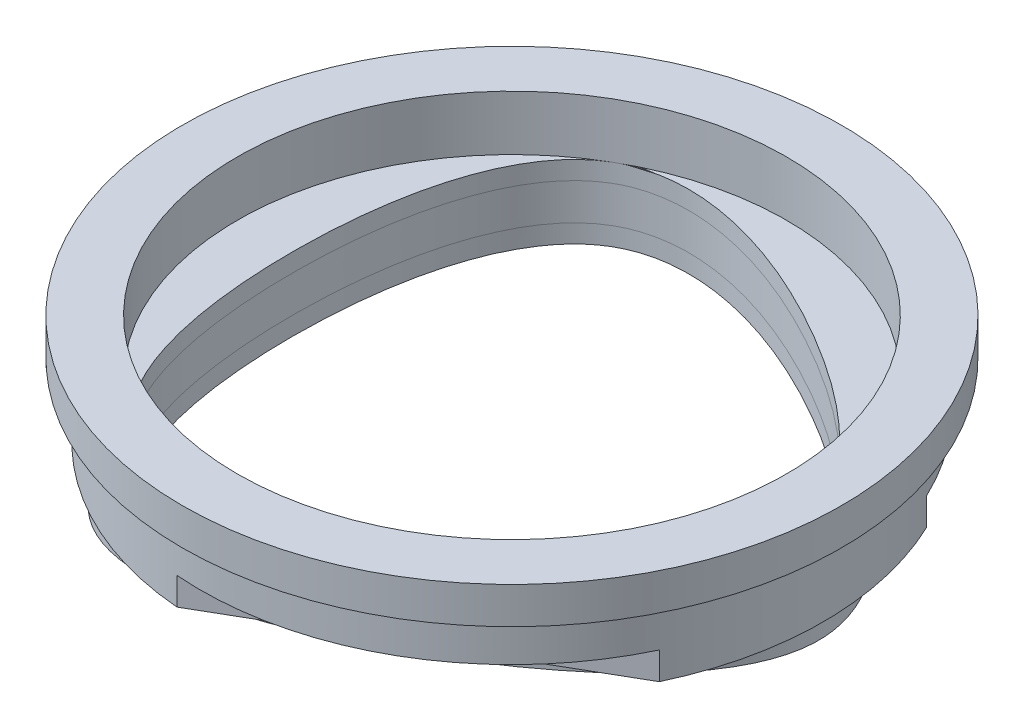
ISO-10303-21;
HEADER;
FILE_DESCRIPTION(('STEP AP214'),'2;1');
FILE_NAME('part.step','',(''),(''),'','','');
FILE_SCHEMA(('AUTOMOTIVE_DESIGN { 1 0 10303 214 1 1 1 1 }'));
ENDSEC;
DATA;
#1=APPLICATION_CONTEXT('core data for automotive mechanical design processes');
#2=APPLICATION_PROTOCOL_DEFINITION('international standard','automotive_design',2000,#1);
#3=PRODUCT_CONTEXT('',#1,'mechanical');
#4=PRODUCT('Part','Part','',(#3));
#5=PRODUCT_RELATED_PRODUCT_CATEGORY('part','',(#4));
#6=PRODUCT_DEFINITION_FORMATION('','',#4);
#7=PRODUCT_DEFINITION_CONTEXT('part definition',#1,'design');
#8=PRODUCT_DEFINITION('design','',#6,#7);
#9=PRODUCT_DEFINITION_SHAPE('','',#8);
#10=(LENGTH_UNIT() NAMED_UNIT(*) SI_UNIT(.MILLI.,.METRE.));
#11=(NAMED_UNIT(*) PLANE_ANGLE_UNIT() SI_UNIT($,.RADIAN.));
#12=(NAMED_UNIT(*) SI_UNIT($,.STERADIAN.) SOLID_ANGLE_UNIT());
#13=UNCERTAINTY_MEASURE_WITH_UNIT(LENGTH_MEASURE(1.E-05),#10,'distance_accuracy_value','');
#14=(GEOMETRIC_REPRESENTATION_CONTEXT(3) GLOBAL_UNCERTAINTY_ASSIGNED_CONTEXT((#13)) GLOBAL_UNIT_ASSIGNED_CONTEXT((#10,
#11,#12)) REPRESENTATION_CONTEXT('',''));
#15=CARTESIAN_POINT('',(0.,0.,0.));
#16=DIRECTION('',(0.,0.,1.));
#17=DIRECTION('',(1.,0.,0.));
#18=AXIS2_PLACEMENT_3D('',#15,#16,#17);
#19=CARTESIAN_POINT('',(-74.9999999999997,40.,129.903810567666));
#20=CARTESIAN_POINT('',(-41.9999999999996,40.,148.956369450924));
#21=CARTESIAN_POINT('',(66.0000000000002,40.,114.315353299546));
#22=CARTESIAN_POINT('',(192.,40.,-1.69876862143176E-13));
#23=CARTESIAN_POINT('',(65.9999999999998,40.,-114.315353299546));
#24=CARTESIAN_POINT('',(-96.0000000000005,40.,-166.276877526612));
#25=CARTESIAN_POINT('',(-132.,40.,3.39301239285928E-13));
#26=CARTESIAN_POINT('',(-108.,40.,110.851251684408));
#27=CARTESIAN_POINT('',(-74.9999999999997,40.,129.903810567666));
#28=B_SPLINE_CURVE_WITH_KNOTS('',3,(#19,#20,#21,#22,#23,#24,#25,#26,#27),.UNSPECIFIED.,.T.,.F.,
(4,1,1,1,1,1,4),(0.,0.166666666666667,0.333333333333333,0.5,0.666666666666667,0.833333333333333,
1.),.UNSPECIFIED.);
#29=DIRECTION('',(0.,-1.,0.));
#30=VECTOR('',#29,1.);
#31=SURFACE_OF_LINEAR_EXTRUSION('',#28,#30);
#32=CARTESIAN_POINT('',(-74.9999999999997,20.,129.903810567666));
#33=CARTESIAN_POINT('',(-41.9999999999996,20.,148.956369450924));
#34=CARTESIAN_POINT('',(66.0000000000002,20.,114.315353299546));
#35=CARTESIAN_POINT('',(192.,20.,-1.69876862143176E-13));
#36=CARTESIAN_POINT('',(65.9999999999998,20.,-114.315353299546));
#37=CARTESIAN_POINT('',(-96.0000000000005,20.,-166.276877526612));
#38=CARTESIAN_POINT('',(-132.,20.,3.39301239285928E-13));
#39=CARTESIAN_POINT('',(-108.,20.,110.851251684408));
#40=CARTESIAN_POINT('',(-74.9999999999997,20.,129.903810567666));
#41=B_SPLINE_CURVE_WITH_KNOTS('',3,(#32,#33,#34,#35,#36,#37,#38,#39,#40),.UNSPECIFIED.,.T.,.F.,
(4,1,1,1,1,1,4),(0.,0.166666666666667,0.333333333333333,0.5,0.666666666666667,0.833333333333333,
1.),.UNSPECIFIED.);
#42=CARTESIAN_POINT('',(-74.9999999999997,20.,129.903810567666));
#43=VERTEX_POINT('',#42);
#44=EDGE_CURVE('E195',#43,#43,#41,.T.);
#45=ORIENTED_EDGE('',*,*,#44,.F.);
#46=EDGE_LOOP('',(#45));
#47=FACE_BOUND('',#46,.T.);
#48=CARTESIAN_POINT('',(-74.9999999999997,30.,129.903810567666));
#49=CARTESIAN_POINT('',(-41.9999999999996,30.,148.956369450924));
#50=CARTESIAN_POINT('',(66.0000000000002,30.,114.315353299546));
#51=CARTESIAN_POINT('',(192.,30.,-1.69876862143176E-13));
#52=CARTESIAN_POINT('',(65.9999999999998,30.,-114.315353299546));
#53=CARTESIAN_POINT('',(-96.0000000000005,30.,-166.276877526612));
#54=CARTESIAN_POINT('',(-132.,30.,3.39301239285928E-13));
#55=CARTESIAN_POINT('',(-108.,30.,110.851251684408));
#56=CARTESIAN_POINT('',(-74.9999999999997,30.,129.903810567666));
#57=B_SPLINE_CURVE_WITH_KNOTS('',3,(#48,#49,#50,#51,#52,#53,#54,#55,#56),.UNSPECIFIED.,.T.,.F.,
(4,1,1,1,1,1,4),(0.,0.166666666666667,0.333333333333333,0.5,0.666666666666667,0.833333333333333,
1.),.UNSPECIFIED.);
#58=CARTESIAN_POINT('',(-75.0000000000005,30.,-129.903810567666));
#59=VERTEX_POINT('',#58);
#60=CARTESIAN_POINT('',(-74.9999999999997,30.,129.903810567666));
#61=VERTEX_POINT('',#60);
#62=EDGE_CURVE('E44',#59,#61,#57,.T.);
#63=ORIENTED_EDGE('',*,*,#62,.T.);
#64=CARTESIAN_POINT('',(150.,30.,-1.28280281941189E-13));
#65=VERTEX_POINT('',#64);
#66=EDGE_CURVE('E11',#61,#65,#57,.T.);
#67=ORIENTED_EDGE('',*,*,#66,.T.);
#68=EDGE_CURVE('E52',#65,#59,#57,.T.);
#69=ORIENTED_EDGE('',*,*,#68,.T.);
#70=EDGE_LOOP('',(#63,#67,#69));
#71=FACE_BOUND('',#70,.T.);
#72=ADVANCED_FACE('F39',(#47,#71),#31,.T.);
#73=CARTESIAN_POINT('',(66.2499999999992,-10.,-114.748366001438));
#74=CARTESIAN_POINT('',(12.499999999999,-10.,-145.78094297038));
#75=CARTESIAN_POINT('',(-107.500000000001,-10.,-186.195461813654));
#76=CARTESIAN_POINT('',(-145.,-10.,4.46881482195118E-13));
#77=CARTESIAN_POINT('',(-107.5,-10.,186.195461813655));
#78=CARTESIAN_POINT('',(72.5000000000002,-10.,125.573683548743));
#79=CARTESIAN_POINT('',(215.,-10.,-4.2890687836575E-13));
#80=CARTESIAN_POINT('',(119.999999999999,-10.,-83.7157890324953));
#81=CARTESIAN_POINT('',(66.2499999999992,-10.,-114.748366001438));
#82=B_SPLINE_CURVE_WITH_KNOTS('',3,(#73,#74,#75,#76,#77,#78,#79,#80,#81),.UNSPECIFIED.,.T.,.F.,
(4,1,1,1,1,1,4),(0.,0.166666666666667,0.333333333333333,0.5,0.666666666666667,0.833333333333333,
1.),.UNSPECIFIED.);
#83=DIRECTION('',(0.,1.,0.));
#84=VECTOR('',#83,1.);
#85=SURFACE_OF_LINEAR_EXTRUSION('',#82,#84);
#86=CARTESIAN_POINT('',(66.2499999999992,-10.,-114.748366001438));
#87=VERTEX_POINT('',#86);
#88=EDGE_CURVE('E127',#87,#87,#82,.T.);
#89=ORIENTED_EDGE('',*,*,#88,.T.);
#90=EDGE_LOOP('',(#89));
#91=FACE_BOUND('',#90,.T.);
#92=CARTESIAN_POINT('',(66.2499999999992,0.,-114.748366001438));
#93=CARTESIAN_POINT('',(12.499999999999,0.,-145.78094297038));
#94=CARTESIAN_POINT('',(-107.500000000001,0.,-186.195461813654));
#95=CARTESIAN_POINT('',(-145.,0.,4.46881482195118E-13));
#96=CARTESIAN_POINT('',(-107.5,0.,186.195461813655));
#97=CARTESIAN_POINT('',(72.5000000000002,0.,125.573683548743));
#98=CARTESIAN_POINT('',(215.,0.,-4.2890687836575E-13));
#99=CARTESIAN_POINT('',(119.999999999999,0.,-83.7157890324953));
#100=CARTESIAN_POINT('',(66.2499999999992,0.,-114.748366001438));
#101=B_SPLINE_CURVE_WITH_KNOTS('',3,(#92,#93,#94,#95,#96,#97,#98,#99,#100),.UNSPECIFIED.,.T.,
.F.,(4,1,1,1,1,1,4),(0.,0.166666666666667,0.333333333333333,0.5,0.666666666666667,
0.833333333333333,1.),.UNSPECIFIED.);
#102=CARTESIAN_POINT('',(66.2499999999992,0.,-114.748366001438));
#103=VERTEX_POINT('',#102);
#104=EDGE_CURVE('E130',#103,#103,#101,.T.);
#105=ORIENTED_EDGE('',*,*,#104,.F.);
#106=EDGE_LOOP('',(#105));
#107=FACE_BOUND('',#106,.T.);
#108=ADVANCED_FACE('F41',(#91,#107),#85,.T.);
#109=CARTESIAN_POINT('',(-83.7499999999996,-10.,145.059255133894));
#110=DIRECTION('',(0.,1.,0.));
#111=DIRECTION('',(0.,0.,1.));
#112=AXIS2_PLACEMENT_3D('',#109,#110,#111);
#113=PLANE('',#112);
#114=CARTESIAN_POINT('',(60.,-10.,-103.923048454133));
#115=CARTESIAN_POINT('',(11.9999999999998,-10.,-131.635861375235));
#116=CARTESIAN_POINT('',(-96.0000000000005,-10.,-166.276877526612));
#117=CARTESIAN_POINT('',(-132.,-10.,3.65362127849554E-13));
#118=CARTESIAN_POINT('',(-95.9999999999997,-10.,166.276877526613));
#119=CARTESIAN_POINT('',(66.0000000000002,-10.,114.315353299546));
#120=CARTESIAN_POINT('',(192.,-10.,0.));
#121=CARTESIAN_POINT('',(108.,-10.,-76.2102355330306));
#122=CARTESIAN_POINT('',(60.,-10.,-103.923048454133));
#123=B_SPLINE_CURVE_WITH_KNOTS('',3,(#114,#115,#116,#117,#118,#119,#120,#121,#122),
.UNSPECIFIED.,.T.,.F.,(4,1,1,1,1,1,4),(0.,0.166666666666667,0.333333333333333,0.5,
0.666666666666667,0.833333333333333,1.),.UNSPECIFIED.);
#124=CARTESIAN_POINT('',(60.,-10.,-103.923048454133));
#125=VERTEX_POINT('',#124);
#126=EDGE_CURVE('E135',#125,#125,#123,.T.);
#127=ORIENTED_EDGE('',*,*,#126,.T.);
#128=EDGE_LOOP('',(#127));
#129=FACE_BOUND('',#128,.T.);
#130=ORIENTED_EDGE('',*,*,#88,.F.);
#131=EDGE_LOOP('',(#130));
#132=FACE_BOUND('',#131,.T.);
#133=ADVANCED_FACE('F164',(#129,#132),#113,.F.);
#134=DIRECTION('',(0.,1.,0.));
#135=VECTOR('',#134,1.);
#136=SURFACE_OF_LINEAR_EXTRUSION('',#123,#135);
#137=ORIENTED_EDGE('',*,*,#126,.F.);
#138=EDGE_LOOP('',(#137));
#139=FACE_BOUND('',#138,.T.);
#140=CARTESIAN_POINT('',(-75.0000000000007,0.,-129.903810567665));
#141=CARTESIAN_POINT('',(-108.,0.,-110.851251684408));
#142=CARTESIAN_POINT('',(-132.,0.,2.13082205778997E-13));
#143=CARTESIAN_POINT('',(-95.9999999999997,0.,166.276877526613));
#144=CARTESIAN_POINT('',(66.0000000000002,0.,114.315353299546));
#145=CARTESIAN_POINT('',(192.,0.,-1.16534567007794E-13));
#146=CARTESIAN_POINT('',(65.9999999999999,0.,-114.315353299546));
#147=CARTESIAN_POINT('',(-42.0000000000006,0.,-148.956369450923));
#148=CARTESIAN_POINT('',(-75.0000000000007,0.,-129.903810567665));
#149=B_SPLINE_CURVE_WITH_KNOTS('',3,(#140,#141,#142,#143,#144,#145,#146,#147,#148),
.UNSPECIFIED.,.T.,.F.,(4,1,1,1,1,1,4),(0.,0.166666666666666,0.333333333333333,0.5,
0.666666666666666,0.833333333333333,1.),.UNSPECIFIED.);
#150=CARTESIAN_POINT('',(-75.0000000000007,0.,-129.903810567665));
#151=VERTEX_POINT('',#150);
#152=EDGE_CURVE('E211',#151,#151,#149,.T.);
#153=ORIENTED_EDGE('',*,*,#152,.T.);
#154=EDGE_LOOP('',(#153));
#155=FACE_BOUND('',#154,.T.);
#156=ADVANCED_FACE('F160',(#139,#155),#136,.F.);
#157=CARTESIAN_POINT('',(0.,0.,0.));
#158=DIRECTION('',(0.,1.,0.));
#159=DIRECTION('',(0.,0.,1.));
#160=AXIS2_PLACEMENT_3D('',#157,#158,#159);
#161=PLANE('',#160);
#162=CARTESIAN_POINT('',(0.,0.,0.));
#163=DIRECTION('',(0.,1.,0.));
#164=DIRECTION('',(0.,0.,1.));
#165=AXIS2_PLACEMENT_3D('',#162,#163,#164);
#166=CIRCLE('',#165,170.);
#167=CARTESIAN_POINT('',(-13.5164654424508,0.,-169.461810334786));
#168=VERTEX_POINT('',#167);
#169=CARTESIAN_POINT('',(-140.,0.,-96.4365076099295));
#170=VERTEX_POINT('',#169);
#171=EDGE_CURVE('E224',#168,#170,#166,.T.);
#172=ORIENTED_EDGE('',*,*,#171,.F.);
#173=DIRECTION('',(-0.86602540378444,0.,-0.499999999999998));
#174=VECTOR('',#173,1.);
#175=CARTESIAN_POINT('',(-13.5164654424508,0.,-169.461810334786));
#176=LINE('',#175,#174);
#177=CARTESIAN_POINT('',(153.51646544245,0.,-73.0253027248571));
#178=VERTEX_POINT('',#177);
#179=EDGE_CURVE('E246',#178,#168,#176,.T.);
#180=ORIENTED_EDGE('',*,*,#179,.F.);
#181=CARTESIAN_POINT('',(0.,0.,0.));
#182=DIRECTION('',(0.,1.,0.));
#183=DIRECTION('',(0.,0.,1.));
#184=AXIS2_PLACEMENT_3D('',#181,#182,#183);
#185=CIRCLE('',#184,170.);
#186=CARTESIAN_POINT('',(153.51646544245,0.,73.0253027248566));
#187=VERTEX_POINT('',#186);
#188=EDGE_CURVE('E242',#187,#178,#185,.T.);
#189=ORIENTED_EDGE('',*,*,#188,.F.);
#190=DIRECTION('',(0.866025403784438,0.,-0.5));
#191=VECTOR('',#190,1.);
#192=CARTESIAN_POINT('',(153.51646544245,0.,73.0253027248566));
#193=LINE('',#192,#191);
#194=CARTESIAN_POINT('',(-13.5164654424503,0.,169.461810334786));
#195=VERTEX_POINT('',#194);
#196=EDGE_CURVE('E238',#195,#187,#193,.T.);
#197=ORIENTED_EDGE('',*,*,#196,.F.);
#198=CARTESIAN_POINT('',(0.,0.,0.));
#199=DIRECTION('',(0.,1.,0.));
#200=DIRECTION('',(0.,0.,1.));
#201=AXIS2_PLACEMENT_3D('',#198,#199,#200);
#202=CIRCLE('',#201,170.);
#203=CARTESIAN_POINT('',(-140.,0.,96.4365076099295));
#204=VERTEX_POINT('',#203);
#205=EDGE_CURVE('E234',#204,#195,#202,.T.);
#206=ORIENTED_EDGE('',*,*,#205,.F.);
#207=DIRECTION('',(0.,0.,1.));
#208=VECTOR('',#207,1.);
#209=CARTESIAN_POINT('',(-140.,0.,96.4365076099296));
#210=LINE('',#209,#208);
#211=EDGE_CURVE('E230',#170,#204,#210,.T.);
#212=ORIENTED_EDGE('',*,*,#211,.F.);
#213=EDGE_LOOP('',(#172,#180,#189,#197,#206,#212));
#214=FACE_BOUND('',#213,.T.);
#215=ORIENTED_EDGE('',*,*,#104,.T.);
#216=EDGE_LOOP('',(#215));
#217=FACE_BOUND('',#216,.T.);
#218=ADVANCED_FACE('F163',(#214,#217),#161,.F.);
#219=CARTESIAN_POINT('',(0.,20.,0.));
#220=DIRECTION('',(0.,-1.,0.));
#221=DIRECTION('',(0.,0.,-1.));
#222=AXIS2_PLACEMENT_3D('',#219,#220,#221);
#223=CYLINDRICAL_SURFACE('',#222,170.);
#224=DIRECTION('',(0.,-1.,0.));
#225=VECTOR('',#224,1.);
#226=CARTESIAN_POINT('',(153.51646544245,20.,-73.0253027248571));
#227=LINE('',#226,#225);
#228=CARTESIAN_POINT('',(153.51646544245,15.,-73.0253027248571));
#229=VERTEX_POINT('',#228);
#230=EDGE_CURVE('E251',#229,#178,#227,.T.);
#231=ORIENTED_EDGE('',*,*,#230,.F.);
#232=CARTESIAN_POINT('',(0.,15.,0.));
#233=DIRECTION('',(0.,-1.,0.));
#234=DIRECTION('',(0.,0.,-1.));
#235=AXIS2_PLACEMENT_3D('',#232,#233,#234);
#236=CIRCLE('',#235,170.);
#237=CARTESIAN_POINT('',(-13.5164654424508,15.,-169.461810334786));
#238=VERTEX_POINT('',#237);
#239=EDGE_CURVE('E125',#238,#229,#236,.T.);
#240=ORIENTED_EDGE('',*,*,#239,.F.);
#241=DIRECTION('',(0.,-1.,0.));
#242=VECTOR('',#241,1.);
#243=CARTESIAN_POINT('',(-13.5164654424508,20.,-169.461810334786));
#244=LINE('',#243,#242);
#245=EDGE_CURVE('E66',#238,#168,#244,.T.);
#246=ORIENTED_EDGE('',*,*,#245,.T.);
#247=ORIENTED_EDGE('',*,*,#171,.T.);
#248=DIRECTION('',(0.,-1.,0.));
#249=VECTOR('',#248,1.);
#250=CARTESIAN_POINT('',(-140.,20.,-96.4365076099295));
#251=LINE('',#250,#249);
#252=CARTESIAN_POINT('',(-140.,15.,-96.4365076099295));
#253=VERTEX_POINT('',#252);
#254=EDGE_CURVE('E154',#253,#170,#251,.T.);
#255=ORIENTED_EDGE('',*,*,#254,.F.);
#256=CARTESIAN_POINT('',(0.,15.,0.));
#257=DIRECTION('',(0.,-1.,0.));
#258=DIRECTION('',(0.,0.,-1.));
#259=AXIS2_PLACEMENT_3D('',#256,#257,#258);
#260=CIRCLE('',#259,170.);
#261=CARTESIAN_POINT('',(-140.,15.,96.4365076099295));
#262=VERTEX_POINT('',#261);
#263=EDGE_CURVE('E448',#262,#253,#260,.T.);
#264=ORIENTED_EDGE('',*,*,#263,.F.);
#265=DIRECTION('',(0.,-1.,0.));
#266=VECTOR('',#265,1.);
#267=CARTESIAN_POINT('',(-140.,20.,96.4365076099295));
#268=LINE('',#267,#266);
#269=EDGE_CURVE('E259',#262,#204,#268,.T.);
#270=ORIENTED_EDGE('',*,*,#269,.T.);
#271=ORIENTED_EDGE('',*,*,#205,.T.);
#272=DIRECTION('',(0.,-1.,0.));
#273=VECTOR('',#272,1.);
#274=CARTESIAN_POINT('',(-13.5164654424503,20.,169.461810334786));
#275=LINE('',#274,#273);
#276=CARTESIAN_POINT('',(-13.5164654424503,15.,169.461810334786));
#277=VERTEX_POINT('',#276);
#278=EDGE_CURVE('E257',#277,#195,#275,.T.);
#279=ORIENTED_EDGE('',*,*,#278,.F.);
#280=CARTESIAN_POINT('',(0.,15.,0.));
#281=DIRECTION('',(0.,-1.,0.));
#282=DIRECTION('',(0.,0.,-1.));
#283=AXIS2_PLACEMENT_3D('',#280,#281,#282);
#284=CIRCLE('',#283,170.);
#285=CARTESIAN_POINT('',(153.51646544245,15.,73.0253027248566));
#286=VERTEX_POINT('',#285);
#287=EDGE_CURVE('E441',#286,#277,#284,.T.);
#288=ORIENTED_EDGE('',*,*,#287,.F.);
#289=DIRECTION('',(0.,-1.,0.));
#290=VECTOR('',#289,1.);
#291=CARTESIAN_POINT('',(153.51646544245,20.,73.0253027248566));
#292=LINE('',#291,#290);
#293=EDGE_CURVE('E254',#286,#187,#292,.T.);
#294=ORIENTED_EDGE('',*,*,#293,.T.);
#295=ORIENTED_EDGE('',*,*,#188,.T.);
#296=EDGE_LOOP('',(#231,#240,#246,#247,#255,#264,#270,#271,#279,#288,#294,#295));
#297=FACE_BOUND('',#296,.T.);
#298=CARTESIAN_POINT('',(5.33338368758333E-13,40.,-3.17794666316295E-13));
#299=DIRECTION('',(0.,1.,0.));
#300=DIRECTION('',(0.,0.,1.));
#301=AXIS2_PLACEMENT_3D('',#298,#299,#300);
#302=CIRCLE('',#301,170.);
#303=CARTESIAN_POINT('',(5.33338368758333E-13,40.,170.));
#304=VERTEX_POINT('',#303);
#305=EDGE_CURVE('E204',#304,#304,#302,.T.);
#306=ORIENTED_EDGE('',*,*,#305,.F.);
#307=EDGE_LOOP('',(#306));
#308=FACE_BOUND('',#307,.T.);
#309=ADVANCED_FACE('F166',(#297,#308),#223,.T.);
#310=CARTESIAN_POINT('',(-140.,20.,96.4365076099296));
#311=DIRECTION('',(1.,0.,0.));
#312=DIRECTION('',(0.,0.,-1.));
#313=AXIS2_PLACEMENT_3D('',#310,#311,#312);
#314=PLANE('',#313);
#315=ORIENTED_EDGE('',*,*,#269,.F.);
#316=DIRECTION('',(0.,0.,1.));
#317=VECTOR('',#316,1.);
#318=CARTESIAN_POINT('',(-140.,15.,96.4365076099295));
#319=LINE('',#318,#317);
#320=EDGE_CURVE('E270',#253,#262,#319,.T.);
#321=ORIENTED_EDGE('',*,*,#320,.F.);
#322=ORIENTED_EDGE('',*,*,#254,.T.);
#323=ORIENTED_EDGE('',*,*,#211,.T.);
#324=EDGE_LOOP('',(#315,#321,#322,#323));
#325=FACE_BOUND('',#324,.T.);
#326=ADVANCED_FACE('F268',(#325),#314,.F.);
#327=CARTESIAN_POINT('',(153.51646544245,20.,73.0253027248566));
#328=DIRECTION('',(-0.5,0.,-0.866025403784438));
#329=DIRECTION('',(-0.866025403784439,0.,0.5));
#330=AXIS2_PLACEMENT_3D('',#327,#328,#329);
#331=PLANE('',#330);
#332=ORIENTED_EDGE('',*,*,#293,.F.);
#333=DIRECTION('',(0.866025403784438,0.,-0.5));
#334=VECTOR('',#333,1.);
#335=CARTESIAN_POINT('',(-13.5164654424503,15.,169.461810334786));
#336=LINE('',#335,#334);
#337=EDGE_CURVE('E437',#277,#286,#336,.T.);
#338=ORIENTED_EDGE('',*,*,#337,.F.);
#339=ORIENTED_EDGE('',*,*,#278,.T.);
#340=ORIENTED_EDGE('',*,*,#196,.T.);
#341=EDGE_LOOP('',(#332,#338,#339,#340));
#342=FACE_BOUND('',#341,.T.);
#343=ADVANCED_FACE('F381',(#342),#331,.F.);
#344=CARTESIAN_POINT('',(-13.5164654424508,20.,-169.461810334786));
#345=DIRECTION('',(-0.499999999999998,0.,0.86602540378444));
#346=DIRECTION('',(0.86602540378444,0.,0.499999999999998));
#347=AXIS2_PLACEMENT_3D('',#344,#345,#346);
#348=PLANE('',#347);
#349=ORIENTED_EDGE('',*,*,#245,.F.);
#350=DIRECTION('',(-0.86602540378444,0.,-0.499999999999998));
#351=VECTOR('',#350,1.);
#352=CARTESIAN_POINT('',(-13.5164654424508,15.,-169.461810334786));
#353=LINE('',#352,#351);
#354=EDGE_CURVE('E451',#229,#238,#353,.T.);
#355=ORIENTED_EDGE('',*,*,#354,.F.);
#356=ORIENTED_EDGE('',*,*,#230,.T.);
#357=ORIENTED_EDGE('',*,*,#179,.T.);
#358=EDGE_LOOP('',(#349,#355,#356,#357));
#359=FACE_BOUND('',#358,.T.);
#360=ADVANCED_FACE('F291',(#359),#348,.F.);
#361=CARTESIAN_POINT('',(-75.0000000000007,20.,-129.903810567665));
#362=CARTESIAN_POINT('',(-108.,20.,-110.851251684408));
#363=CARTESIAN_POINT('',(-132.,20.,2.13082205778997E-13));
#364=CARTESIAN_POINT('',(-95.9999999999997,20.,166.276877526613));
#365=CARTESIAN_POINT('',(66.0000000000002,20.,114.315353299546));
#366=CARTESIAN_POINT('',(192.,20.,-1.16534567007794E-13));
#367=CARTESIAN_POINT('',(65.9999999999999,20.,-114.315353299546));
#368=CARTESIAN_POINT('',(-42.0000000000006,20.,-148.956369450923));
#369=CARTESIAN_POINT('',(-75.0000000000007,20.,-129.903810567665));
#370=B_SPLINE_CURVE_WITH_KNOTS('',3,(#361,#362,#363,#364,#365,#366,#367,#368,#369),
.UNSPECIFIED.,.T.,.F.,(4,1,1,1,1,1,4),(0.,0.166666666666666,0.333333333333333,0.5,
0.666666666666666,0.833333333333333,1.),.UNSPECIFIED.);
#371=DIRECTION('',(0.,-1.,0.));
#372=VECTOR('',#371,1.);
#373=SURFACE_OF_LINEAR_EXTRUSION('',#370,#372);
#374=ORIENTED_EDGE('',*,*,#44,.T.);
#375=EDGE_LOOP('',(#374));
#376=FACE_BOUND('',#375,.T.);
#377=ORIENTED_EDGE('',*,*,#152,.F.);
#378=EDGE_LOOP('',(#377));
#379=FACE_BOUND('',#378,.T.);
#380=ADVANCED_FACE('F185',(#376,#379),#373,.T.);
#381=CARTESIAN_POINT('',(0.,40.,0.));
#382=DIRECTION('',(0.,1.,0.));
#383=DIRECTION('',(0.,0.,1.));
#384=AXIS2_PLACEMENT_3D('',#381,#382,#383);
#385=PLANE('',#384);
#386=CARTESIAN_POINT('',(0.,40.,0.));
#387=DIRECTION('',(0.,1.,0.));
#388=DIRECTION('',(0.,0.,1.));
#389=AXIS2_PLACEMENT_3D('',#386,#387,#388);
#390=CIRCLE('',#389,180.);
#391=CARTESIAN_POINT('',(0.,40.,180.));
#392=VERTEX_POINT('',#391);
#393=EDGE_CURVE('E193',#392,#392,#390,.T.);
#394=ORIENTED_EDGE('',*,*,#393,.F.);
#395=EDGE_LOOP('',(#394));
#396=FACE_BOUND('',#395,.T.);
#397=ORIENTED_EDGE('',*,*,#305,.T.);
#398=EDGE_LOOP('',(#397));
#399=FACE_BOUND('',#398,.T.);
#400=ADVANCED_FACE('F281',(#396,#399),#385,.F.);
#401=CARTESIAN_POINT('',(0.,60.,0.));
#402=DIRECTION('',(0.,1.,0.));
#403=DIRECTION('',(0.,0.,1.));
#404=AXIS2_PLACEMENT_3D('',#401,#402,#403);
#405=PLANE('',#404);
#406=CARTESIAN_POINT('',(0.,60.,0.));
#407=DIRECTION('',(0.,1.,0.));
#408=DIRECTION('',(0.,0.,1.));
#409=AXIS2_PLACEMENT_3D('',#406,#407,#408);
#410=CIRCLE('',#409,180.);
#411=CARTESIAN_POINT('',(0.,60.,180.));
#412=VERTEX_POINT('',#411);
#413=EDGE_CURVE('E205',#412,#412,#410,.T.);
#414=ORIENTED_EDGE('',*,*,#413,.T.);
#415=EDGE_LOOP('',(#414));
#416=FACE_BOUND('',#415,.T.);
#417=CARTESIAN_POINT('',(0.,60.,0.));
#418=DIRECTION('',(0.,1.,0.));
#419=DIRECTION('',(0.,0.,1.));
#420=AXIS2_PLACEMENT_3D('',#417,#418,#419);
#421=CIRCLE('',#420,150.);
#422=CARTESIAN_POINT('',(0.,60.,150.));
#423=VERTEX_POINT('',#422);
#424=EDGE_CURVE('E433',#423,#423,#421,.T.);
#425=ORIENTED_EDGE('',*,*,#424,.F.);
#426=EDGE_LOOP('',(#425));
#427=FACE_BOUND('',#426,.T.);
#428=ADVANCED_FACE('F283',(#416,#427),#405,.T.);
#429=CARTESIAN_POINT('',(0.,60.,0.));
#430=DIRECTION('',(0.,-1.,0.));
#431=DIRECTION('',(0.,0.,-1.));
#432=AXIS2_PLACEMENT_3D('',#429,#430,#431);
#433=CYLINDRICAL_SURFACE('',#432,180.);
#434=ORIENTED_EDGE('',*,*,#413,.F.);
#435=EDGE_LOOP('',(#434));
#436=FACE_BOUND('',#435,.T.);
#437=ORIENTED_EDGE('',*,*,#393,.T.);
#438=EDGE_LOOP('',(#437));
#439=FACE_BOUND('',#438,.T.);
#440=ADVANCED_FACE('F183',(#436,#439),#433,.T.);
#441=CARTESIAN_POINT('',(0.,60.,0.));
#442=DIRECTION('',(0.,-1.,0.));
#443=DIRECTION('',(0.,0.,-1.));
#444=AXIS2_PLACEMENT_3D('',#441,#442,#443);
#445=CYLINDRICAL_SURFACE('',#444,150.);
#446=CARTESIAN_POINT('',(0.,30.,0.));
#447=DIRECTION('',(0.,1.,0.));
#448=DIRECTION('',(0.,0.,1.));
#449=AXIS2_PLACEMENT_3D('',#446,#447,#448);
#450=CIRCLE('',#449,150.);
#451=EDGE_CURVE('E111',#65,#59,#450,.T.);
#452=ORIENTED_EDGE('',*,*,#451,.F.);
#453=EDGE_CURVE('E117',#61,#65,#450,.T.);
#454=ORIENTED_EDGE('',*,*,#453,.F.);
#455=EDGE_CURVE('E58',#59,#61,#450,.T.);
#456=ORIENTED_EDGE('',*,*,#455,.F.);
#457=EDGE_LOOP('',(#452,#454,#456));
#458=FACE_BOUND('',#457,.T.);
#459=ORIENTED_EDGE('',*,*,#424,.T.);
#460=EDGE_LOOP('',(#459));
#461=FACE_BOUND('',#460,.T.);
#462=ADVANCED_FACE('F122',(#458,#461),#445,.F.);
#463=CARTESIAN_POINT('',(0.,15.,0.));
#464=DIRECTION('',(0.,-1.,0.));
#465=DIRECTION('',(0.,0.,-1.));
#466=AXIS2_PLACEMENT_3D('',#463,#464,#465);
#467=PLANE('',#466);
#468=ORIENTED_EDGE('',*,*,#287,.T.);
#469=ORIENTED_EDGE('',*,*,#337,.T.);
#470=EDGE_LOOP('',(#468,#469));
#471=FACE_BOUND('',#470,.T.);
#472=ADVANCED_FACE('F297',(#471),#467,.T.);
#473=CARTESIAN_POINT('',(0.,15.,0.));
#474=DIRECTION('',(0.,-1.,0.));
#475=DIRECTION('',(0.,0.,-1.));
#476=AXIS2_PLACEMENT_3D('',#473,#474,#475);
#477=PLANE('',#476);
#478=ORIENTED_EDGE('',*,*,#263,.T.);
#479=ORIENTED_EDGE('',*,*,#320,.T.);
#480=EDGE_LOOP('',(#478,#479));
#481=FACE_BOUND('',#480,.T.);
#482=ADVANCED_FACE('F300',(#481),#477,.T.);
#483=CARTESIAN_POINT('',(0.,15.,0.));
#484=DIRECTION('',(0.,-1.,0.));
#485=DIRECTION('',(0.,0.,-1.));
#486=AXIS2_PLACEMENT_3D('',#483,#484,#485);
#487=PLANE('',#486);
#488=ORIENTED_EDGE('',*,*,#239,.T.);
#489=ORIENTED_EDGE('',*,*,#354,.T.);
#490=EDGE_LOOP('',(#488,#489));
#491=FACE_BOUND('',#490,.T.);
#492=ADVANCED_FACE('F304',(#491),#487,.T.);
#493=CARTESIAN_POINT('',(0.,30.,0.));
#494=DIRECTION('',(0.,1.,0.));
#495=DIRECTION('',(0.,0.,1.));
#496=AXIS2_PLACEMENT_3D('',#493,#494,#495);
#497=PLANE('',#496);
#498=ORIENTED_EDGE('',*,*,#453,.T.);
#499=ORIENTED_EDGE('',*,*,#66,.F.);
#500=EDGE_LOOP('',(#498,#499));
#501=FACE_BOUND('',#500,.T.);
#502=ADVANCED_FACE('F118',(#501),#497,.T.);
#503=ORIENTED_EDGE('',*,*,#451,.T.);
#504=ORIENTED_EDGE('',*,*,#68,.F.);
#505=EDGE_LOOP('',(#503,#504));
#506=FACE_BOUND('',#505,.T.);
#507=ADVANCED_FACE('F109',(#506),#497,.T.);
#508=ORIENTED_EDGE('',*,*,#455,.T.);
#509=ORIENTED_EDGE('',*,*,#62,.F.);
#510=EDGE_LOOP('',(#508,#509));
#511=FACE_BOUND('',#510,.T.);
#512=ADVANCED_FACE('F309',(#511),#497,.T.);
#513=CLOSED_SHELL('',(#72,#108,#133,#156,#218,#309,#326,#343,#360,#380,#400,#428,#440,#462,#472,
#482,#492,#502,#507,#512));
#514=MANIFOLD_SOLID_BREP('B2',#513);
#515=ADVANCED_BREP_SHAPE_REPRESENTATION('',(#18,#514),#14);
#516=SHAPE_DEFINITION_REPRESENTATION(#9,#515);
ENDSEC;
END-ISO-10303-21;
